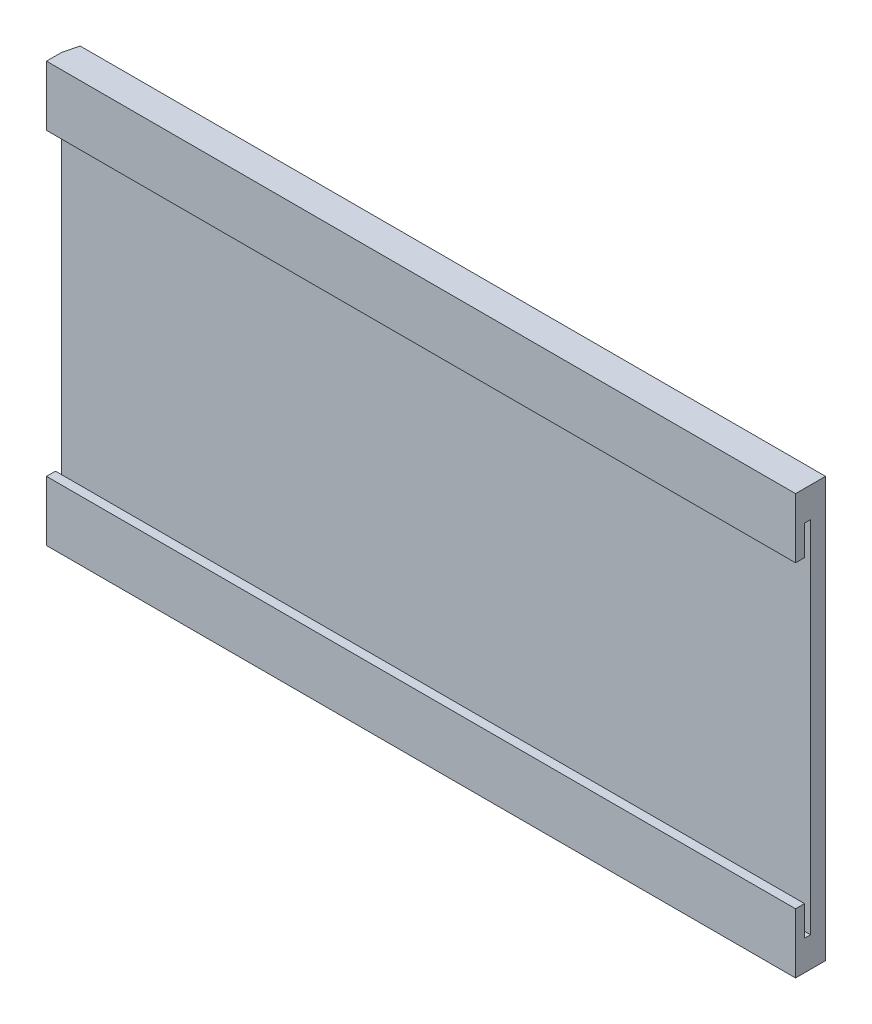
ISO-10303-21;
HEADER;
FILE_DESCRIPTION(('STEP AP214'),'2;1');
FILE_NAME('part.step','',(''),(''),'','','');
FILE_SCHEMA(('AUTOMOTIVE_DESIGN { 1 0 10303 214 1 1 1 1 }'));
ENDSEC;
DATA;
#1=APPLICATION_CONTEXT('core data for automotive mechanical design processes');
#2=APPLICATION_PROTOCOL_DEFINITION('international standard','automotive_design',2000,#1);
#3=PRODUCT_CONTEXT('',#1,'mechanical');
#4=PRODUCT('Part','Part','',(#3));
#5=PRODUCT_RELATED_PRODUCT_CATEGORY('part','',(#4));
#6=PRODUCT_DEFINITION_FORMATION('','',#4);
#7=PRODUCT_DEFINITION_CONTEXT('part definition',#1,'design');
#8=PRODUCT_DEFINITION('design','',#6,#7);
#9=PRODUCT_DEFINITION_SHAPE('','',#8);
#10=(LENGTH_UNIT() NAMED_UNIT(*) SI_UNIT(.MILLI.,.METRE.));
#11=(NAMED_UNIT(*) PLANE_ANGLE_UNIT() SI_UNIT($,.RADIAN.));
#12=(NAMED_UNIT(*) SI_UNIT($,.STERADIAN.) SOLID_ANGLE_UNIT());
#13=UNCERTAINTY_MEASURE_WITH_UNIT(LENGTH_MEASURE(1.E-05),#10,'distance_accuracy_value','');
#14=(GEOMETRIC_REPRESENTATION_CONTEXT(3) GLOBAL_UNCERTAINTY_ASSIGNED_CONTEXT((#13)) GLOBAL_UNIT_ASSIGNED_CONTEXT((#10,
#11,#12)) REPRESENTATION_CONTEXT('',''));
#15=CARTESIAN_POINT('',(0.,0.,0.));
#16=DIRECTION('',(0.,0.,1.));
#17=DIRECTION('',(1.,0.,0.));
#18=AXIS2_PLACEMENT_3D('',#15,#16,#17);
#19=CARTESIAN_POINT('',(0.,0.,-5.));
#20=DIRECTION('',(-1.,0.,0.));
#21=DIRECTION('',(0.,0.,1.));
#22=AXIS2_PLACEMENT_3D('',#19,#20,#21);
#23=PLANE('',#22);
#24=DIRECTION('',(0.,1.,0.));
#25=VECTOR('',#24,1.);
#26=CARTESIAN_POINT('',(0.,-70.,0.));
#27=LINE('',#26,#25);
#28=CARTESIAN_POINT('',(0.,-70.,0.));
#29=VERTEX_POINT('',#28);
#30=CARTESIAN_POINT('',(0.,-60.,0.));
#31=VERTEX_POINT('',#30);
#32=EDGE_CURVE('E238',#29,#31,#27,.T.);
#33=ORIENTED_EDGE('',*,*,#32,.F.);
#34=DIRECTION('',(0.,0.,1.));
#35=VECTOR('',#34,1.);
#36=CARTESIAN_POINT('',(0.,-70.,-5.));
#37=LINE('',#36,#35);
#38=CARTESIAN_POINT('',(0.,-70.,5.));
#39=VERTEX_POINT('',#38);
#40=EDGE_CURVE('E135',#29,#39,#37,.T.);
#41=ORIENTED_EDGE('',*,*,#40,.T.);
#42=DIRECTION('',(0.,-1.,0.));
#43=VECTOR('',#42,1.);
#44=CARTESIAN_POINT('',(0.,0.,5.));
#45=LINE('',#44,#43);
#46=CARTESIAN_POINT('',(0.,-50.,5.));
#47=VERTEX_POINT('',#46);
#48=EDGE_CURVE('E257',#47,#39,#45,.T.);
#49=ORIENTED_EDGE('',*,*,#48,.F.);
#50=DIRECTION('',(0.,0.,-1.));
#51=VECTOR('',#50,1.);
#52=CARTESIAN_POINT('',(0.,-50.,5.));
#53=LINE('',#52,#51);
#54=CARTESIAN_POINT('',(0.,-50.,2.));
#55=VERTEX_POINT('',#54);
#56=EDGE_CURVE('E302',#47,#55,#53,.T.);
#57=ORIENTED_EDGE('',*,*,#56,.T.);
#58=DIRECTION('',(0.,-1.,0.));
#59=VECTOR('',#58,1.);
#60=CARTESIAN_POINT('',(0.,0.,2.));
#61=LINE('',#60,#59);
#62=CARTESIAN_POINT('',(0.,-60.,2.));
#63=VERTEX_POINT('',#62);
#64=EDGE_CURVE('E331',#55,#63,#61,.T.);
#65=ORIENTED_EDGE('',*,*,#64,.T.);
#66=DIRECTION('',(0.,0.,-1.));
#67=VECTOR('',#66,1.);
#68=CARTESIAN_POINT('',(0.,-60.,2.));
#69=LINE('',#68,#67);
#70=EDGE_CURVE('E315',#63,#31,#69,.T.);
#71=ORIENTED_EDGE('',*,*,#70,.T.);
#72=EDGE_LOOP('',(#33,#41,#49,#57,#65,#71));
#73=FACE_BOUND('',#72,.T.);
#74=ADVANCED_FACE('F131',(#73),#23,.T.);
#75=CARTESIAN_POINT('',(0.,0.,5.));
#76=DIRECTION('',(0.,0.,1.));
#77=DIRECTION('',(1.,0.,0.));
#78=AXIS2_PLACEMENT_3D('',#75,#76,#77);
#79=PLANE('',#78);
#80=DIRECTION('',(0.,-1.,0.));
#81=VECTOR('',#80,1.);
#82=CARTESIAN_POINT('',(250.,0.,5.));
#83=LINE('',#82,#81);
#84=CARTESIAN_POINT('',(250.,-50.,5.));
#85=VERTEX_POINT('',#84);
#86=CARTESIAN_POINT('',(250.,-70.,5.));
#87=VERTEX_POINT('',#86);
#88=EDGE_CURVE('E153',#85,#87,#83,.T.);
#89=ORIENTED_EDGE('',*,*,#88,.F.);
#90=DIRECTION('',(1.,0.,0.));
#91=VECTOR('',#90,1.);
#92=CARTESIAN_POINT('',(0.,-50.,5.));
#93=LINE('',#92,#91);
#94=EDGE_CURVE('E284',#47,#85,#93,.T.);
#95=ORIENTED_EDGE('',*,*,#94,.F.);
#96=ORIENTED_EDGE('',*,*,#48,.T.);
#97=DIRECTION('',(1.,0.,0.));
#98=VECTOR('',#97,1.);
#99=CARTESIAN_POINT('',(0.,-70.,5.));
#100=LINE('',#99,#98);
#101=EDGE_CURVE('E263',#39,#87,#100,.T.);
#102=ORIENTED_EDGE('',*,*,#101,.T.);
#103=EDGE_LOOP('',(#89,#95,#96,#102));
#104=FACE_BOUND('',#103,.T.);
#105=ADVANCED_FACE('F283',(#104),#79,.T.);
#106=DIRECTION('',(1.,0.,0.));
#107=VECTOR('',#106,1.);
#108=CARTESIAN_POINT('',(0.,50.,5.));
#109=LINE('',#108,#107);
#110=CARTESIAN_POINT('',(0.,50.,5.));
#111=VERTEX_POINT('',#110);
#112=CARTESIAN_POINT('',(250.,50.,5.));
#113=VERTEX_POINT('',#112);
#114=EDGE_CURVE('E292',#111,#113,#109,.T.);
#115=ORIENTED_EDGE('',*,*,#114,.T.);
#116=CARTESIAN_POINT('',(250.,70.,5.));
#117=VERTEX_POINT('',#116);
#118=EDGE_CURVE('E266',#117,#113,#83,.T.);
#119=ORIENTED_EDGE('',*,*,#118,.F.);
#120=DIRECTION('',(1.,0.,0.));
#121=VECTOR('',#120,1.);
#122=CARTESIAN_POINT('',(0.,70.,5.));
#123=LINE('',#122,#121);
#124=CARTESIAN_POINT('',(0.,70.,5.));
#125=VERTEX_POINT('',#124);
#126=EDGE_CURVE('E255',#125,#117,#123,.T.);
#127=ORIENTED_EDGE('',*,*,#126,.F.);
#128=EDGE_CURVE('E253',#125,#111,#45,.T.);
#129=ORIENTED_EDGE('',*,*,#128,.T.);
#130=EDGE_LOOP('',(#115,#119,#127,#129));
#131=FACE_BOUND('',#130,.T.);
#132=ADVANCED_FACE('F291',(#131),#79,.T.);
#133=CARTESIAN_POINT('',(0.,70.,5.));
#134=DIRECTION('',(0.,1.,0.));
#135=DIRECTION('',(-1.,0.,0.));
#136=AXIS2_PLACEMENT_3D('',#133,#134,#135);
#137=PLANE('',#136);
#138=DIRECTION('',(0.242535625036333,0.,-0.970142500145332));
#139=VECTOR('',#138,1.);
#140=CARTESIAN_POINT('',(0.,70.,0.));
#141=LINE('',#140,#139);
#142=CARTESIAN_POINT('',(0.,70.,0.));
#143=VERTEX_POINT('',#142);
#144=CARTESIAN_POINT('',(1.25,70.,-5.));
#145=VERTEX_POINT('',#144);
#146=EDGE_CURVE('E230',#143,#145,#141,.T.);
#147=ORIENTED_EDGE('',*,*,#146,.F.);
#148=DIRECTION('',(0.,0.,-1.));
#149=VECTOR('',#148,1.);
#150=CARTESIAN_POINT('',(0.,70.,5.));
#151=LINE('',#150,#149);
#152=EDGE_CURVE('E246',#125,#143,#151,.T.);
#153=ORIENTED_EDGE('',*,*,#152,.F.);
#154=ORIENTED_EDGE('',*,*,#126,.T.);
#155=DIRECTION('',(0.,0.,-1.));
#156=VECTOR('',#155,1.);
#157=CARTESIAN_POINT('',(250.,70.,5.));
#158=LINE('',#157,#156);
#159=CARTESIAN_POINT('',(250.,70.,-5.));
#160=VERTEX_POINT('',#159);
#161=EDGE_CURVE('E254',#117,#160,#158,.T.);
#162=ORIENTED_EDGE('',*,*,#161,.T.);
#163=DIRECTION('',(1.,0.,0.));
#164=VECTOR('',#163,1.);
#165=CARTESIAN_POINT('',(0.,70.,-5.));
#166=LINE('',#165,#164);
#167=EDGE_CURVE('E249',#145,#160,#166,.T.);
#168=ORIENTED_EDGE('',*,*,#167,.F.);
#169=EDGE_LOOP('',(#147,#153,#154,#162,#168));
#170=FACE_BOUND('',#169,.T.);
#171=ADVANCED_FACE('F244',(#170),#137,.T.);
#172=CARTESIAN_POINT('',(250.,0.,-5.));
#173=DIRECTION('',(-1.,0.,0.));
#174=DIRECTION('',(0.,0.,1.));
#175=AXIS2_PLACEMENT_3D('',#172,#173,#174);
#176=PLANE('',#175);
#177=DIRECTION('',(0.,0.,-1.));
#178=VECTOR('',#177,1.);
#179=CARTESIAN_POINT('',(250.,50.,5.));
#180=LINE('',#179,#178);
#181=CARTESIAN_POINT('',(250.,50.,2.));
#182=VERTEX_POINT('',#181);
#183=EDGE_CURVE('E294',#113,#182,#180,.T.);
#184=ORIENTED_EDGE('',*,*,#183,.T.);
#185=DIRECTION('',(0.,-1.,0.));
#186=VECTOR('',#185,1.);
#187=CARTESIAN_POINT('',(250.,0.,2.));
#188=LINE('',#187,#186);
#189=CARTESIAN_POINT('',(250.,60.,2.));
#190=VERTEX_POINT('',#189);
#191=EDGE_CURVE('E296',#190,#182,#188,.T.);
#192=ORIENTED_EDGE('',*,*,#191,.F.);
#193=DIRECTION('',(0.,0.,-1.));
#194=VECTOR('',#193,1.);
#195=CARTESIAN_POINT('',(250.,60.,2.));
#196=LINE('',#195,#194);
#197=CARTESIAN_POINT('',(250.,60.,0.));
#198=VERTEX_POINT('',#197);
#199=EDGE_CURVE('E312',#190,#198,#196,.T.);
#200=ORIENTED_EDGE('',*,*,#199,.T.);
#201=DIRECTION('',(0.,-1.,0.));
#202=VECTOR('',#201,1.);
#203=CARTESIAN_POINT('',(250.,0.,0.));
#204=LINE('',#203,#202);
#205=CARTESIAN_POINT('',(250.,-60.,0.));
#206=VERTEX_POINT('',#205);
#207=EDGE_CURVE('E310',#198,#206,#204,.T.);
#208=ORIENTED_EDGE('',*,*,#207,.T.);
#209=DIRECTION('',(0.,0.,-1.));
#210=VECTOR('',#209,1.);
#211=CARTESIAN_POINT('',(250.,-60.,2.));
#212=LINE('',#211,#210);
#213=CARTESIAN_POINT('',(250.,-60.,2.));
#214=VERTEX_POINT('',#213);
#215=EDGE_CURVE('E318',#214,#206,#212,.T.);
#216=ORIENTED_EDGE('',*,*,#215,.F.);
#217=DIRECTION('',(0.,-1.,0.));
#218=VECTOR('',#217,1.);
#219=CARTESIAN_POINT('',(250.,0.,2.));
#220=LINE('',#219,#218);
#221=CARTESIAN_POINT('',(250.,-50.,2.));
#222=VERTEX_POINT('',#221);
#223=EDGE_CURVE('E321',#222,#214,#220,.T.);
#224=ORIENTED_EDGE('',*,*,#223,.F.);
#225=DIRECTION('',(0.,0.,-1.));
#226=VECTOR('',#225,1.);
#227=CARTESIAN_POINT('',(250.,-50.,5.));
#228=LINE('',#227,#226);
#229=EDGE_CURVE('E306',#85,#222,#228,.T.);
#230=ORIENTED_EDGE('',*,*,#229,.F.);
#231=ORIENTED_EDGE('',*,*,#88,.T.);
#232=DIRECTION('',(0.,0.,1.));
#233=VECTOR('',#232,1.);
#234=CARTESIAN_POINT('',(250.,-70.,-5.));
#235=LINE('',#234,#233);
#236=CARTESIAN_POINT('',(250.,-70.,-5.));
#237=VERTEX_POINT('',#236);
#238=EDGE_CURVE('E12',#237,#87,#235,.T.);
#239=ORIENTED_EDGE('',*,*,#238,.F.);
#240=DIRECTION('',(0.,-1.,0.));
#241=VECTOR('',#240,1.);
#242=CARTESIAN_POINT('',(250.,0.,-5.));
#243=LINE('',#242,#241);
#244=EDGE_CURVE('E270',#160,#237,#243,.T.);
#245=ORIENTED_EDGE('',*,*,#244,.F.);
#246=ORIENTED_EDGE('',*,*,#161,.F.);
#247=ORIENTED_EDGE('',*,*,#118,.T.);
#248=EDGE_LOOP('',(#184,#192,#200,#208,#216,#224,#230,#231,#239,#245,#246,#247));
#249=FACE_BOUND('',#248,.T.);
#250=ADVANCED_FACE('F287',(#249),#176,.F.);
#251=CARTESIAN_POINT('',(0.,-70.,-5.));
#252=DIRECTION('',(0.,-1.,0.));
#253=DIRECTION('',(1.,0.,0.));
#254=AXIS2_PLACEMENT_3D('',#251,#252,#253);
#255=PLANE('',#254);
#256=DIRECTION('',(0.242535625036333,0.,-0.970142500145332));
#257=VECTOR('',#256,1.);
#258=CARTESIAN_POINT('',(0.,-70.,0.));
#259=LINE('',#258,#257);
#260=CARTESIAN_POINT('',(1.25,-70.,-5.));
#261=VERTEX_POINT('',#260);
#262=EDGE_CURVE('E239',#29,#261,#259,.T.);
#263=ORIENTED_EDGE('',*,*,#262,.T.);
#264=DIRECTION('',(1.,0.,0.));
#265=VECTOR('',#264,1.);
#266=CARTESIAN_POINT('',(0.,-70.,-5.));
#267=LINE('',#266,#265);
#268=EDGE_CURVE('E145',#261,#237,#267,.T.);
#269=ORIENTED_EDGE('',*,*,#268,.T.);
#270=ORIENTED_EDGE('',*,*,#238,.T.);
#271=ORIENTED_EDGE('',*,*,#101,.F.);
#272=ORIENTED_EDGE('',*,*,#40,.F.);
#273=EDGE_LOOP('',(#263,#269,#270,#271,#272));
#274=FACE_BOUND('',#273,.T.);
#275=ADVANCED_FACE('F285',(#274),#255,.T.);
#276=CARTESIAN_POINT('',(0.,60.,0.));
#277=VERTEX_POINT('',#276);
#278=EDGE_CURVE('E227',#277,#143,#27,.T.);
#279=ORIENTED_EDGE('',*,*,#278,.F.);
#280=DIRECTION('',(0.,0.,-1.));
#281=VECTOR('',#280,1.);
#282=CARTESIAN_POINT('',(0.,60.,2.));
#283=LINE('',#282,#281);
#284=CARTESIAN_POINT('',(0.,60.,2.));
#285=VERTEX_POINT('',#284);
#286=EDGE_CURVE('E336',#285,#277,#283,.T.);
#287=ORIENTED_EDGE('',*,*,#286,.F.);
#288=DIRECTION('',(0.,-1.,0.));
#289=VECTOR('',#288,1.);
#290=CARTESIAN_POINT('',(0.,0.,2.));
#291=LINE('',#290,#289);
#292=CARTESIAN_POINT('',(0.,50.,2.));
#293=VERTEX_POINT('',#292);
#294=EDGE_CURVE('E341',#285,#293,#291,.T.);
#295=ORIENTED_EDGE('',*,*,#294,.T.);
#296=DIRECTION('',(0.,0.,-1.));
#297=VECTOR('',#296,1.);
#298=CARTESIAN_POINT('',(0.,50.,5.));
#299=LINE('',#298,#297);
#300=EDGE_CURVE('E299',#111,#293,#299,.T.);
#301=ORIENTED_EDGE('',*,*,#300,.F.);
#302=ORIENTED_EDGE('',*,*,#128,.F.);
#303=ORIENTED_EDGE('',*,*,#152,.T.);
#304=EDGE_LOOP('',(#279,#287,#295,#301,#302,#303));
#305=FACE_BOUND('',#304,.T.);
#306=ADVANCED_FACE('F133',(#305),#23,.T.);
#307=CARTESIAN_POINT('',(0.,0.,-5.));
#308=DIRECTION('',(0.,0.,1.));
#309=DIRECTION('',(1.,0.,0.));
#310=AXIS2_PLACEMENT_3D('',#307,#308,#309);
#311=PLANE('',#310);
#312=ORIENTED_EDGE('',*,*,#268,.F.);
#313=DIRECTION('',(0.,1.,0.));
#314=VECTOR('',#313,1.);
#315=CARTESIAN_POINT('',(1.25,0.,-5.));
#316=LINE('',#315,#314);
#317=EDGE_CURVE('E326',#261,#145,#316,.T.);
#318=ORIENTED_EDGE('',*,*,#317,.T.);
#319=ORIENTED_EDGE('',*,*,#167,.T.);
#320=ORIENTED_EDGE('',*,*,#244,.T.);
#321=EDGE_LOOP('',(#312,#318,#319,#320));
#322=FACE_BOUND('',#321,.T.);
#323=ADVANCED_FACE('F350',(#322),#311,.F.);
#324=CARTESIAN_POINT('',(0.,50.,5.));
#325=DIRECTION('',(0.,1.,0.));
#326=DIRECTION('',(0.,0.,1.));
#327=AXIS2_PLACEMENT_3D('',#324,#325,#326);
#328=PLANE('',#327);
#329=ORIENTED_EDGE('',*,*,#300,.T.);
#330=DIRECTION('',(1.,0.,0.));
#331=VECTOR('',#330,1.);
#332=CARTESIAN_POINT('',(0.,50.,2.));
#333=LINE('',#332,#331);
#334=EDGE_CURVE('E345',#293,#182,#333,.T.);
#335=ORIENTED_EDGE('',*,*,#334,.T.);
#336=ORIENTED_EDGE('',*,*,#183,.F.);
#337=ORIENTED_EDGE('',*,*,#114,.F.);
#338=EDGE_LOOP('',(#329,#335,#336,#337));
#339=FACE_BOUND('',#338,.T.);
#340=ADVANCED_FACE('F352',(#339),#328,.F.);
#341=CARTESIAN_POINT('',(0.,-50.,5.));
#342=DIRECTION('',(0.,1.,0.));
#343=DIRECTION('',(0.,0.,1.));
#344=AXIS2_PLACEMENT_3D('',#341,#342,#343);
#345=PLANE('',#344);
#346=DIRECTION('',(1.,0.,0.));
#347=VECTOR('',#346,1.);
#348=CARTESIAN_POINT('',(0.,-50.,2.));
#349=LINE('',#348,#347);
#350=EDGE_CURVE('E325',#55,#222,#349,.T.);
#351=ORIENTED_EDGE('',*,*,#350,.F.);
#352=ORIENTED_EDGE('',*,*,#56,.F.);
#353=ORIENTED_EDGE('',*,*,#94,.T.);
#354=ORIENTED_EDGE('',*,*,#229,.T.);
#355=EDGE_LOOP('',(#351,#352,#353,#354));
#356=FACE_BOUND('',#355,.T.);
#357=ADVANCED_FACE('F358',(#356),#345,.T.);
#358=CARTESIAN_POINT('',(0.,0.,0.));
#359=DIRECTION('',(0.,0.,1.));
#360=DIRECTION('',(1.,0.,0.));
#361=AXIS2_PLACEMENT_3D('',#358,#359,#360);
#362=PLANE('',#361);
#363=ORIENTED_EDGE('',*,*,#207,.F.);
#364=DIRECTION('',(1.,0.,0.));
#365=VECTOR('',#364,1.);
#366=CARTESIAN_POINT('',(0.,60.,0.));
#367=LINE('',#366,#365);
#368=EDGE_CURVE('E317',#277,#198,#367,.T.);
#369=ORIENTED_EDGE('',*,*,#368,.F.);
#370=DIRECTION('',(0.,-1.,0.));
#371=VECTOR('',#370,1.);
#372=CARTESIAN_POINT('',(0.,0.,0.));
#373=LINE('',#372,#371);
#374=EDGE_CURVE('E233',#277,#31,#373,.T.);
#375=ORIENTED_EDGE('',*,*,#374,.T.);
#376=DIRECTION('',(1.,0.,0.));
#377=VECTOR('',#376,1.);
#378=CARTESIAN_POINT('',(0.,-60.,0.));
#379=LINE('',#378,#377);
#380=EDGE_CURVE('E322',#31,#206,#379,.T.);
#381=ORIENTED_EDGE('',*,*,#380,.T.);
#382=EDGE_LOOP('',(#363,#369,#375,#381));
#383=FACE_BOUND('',#382,.T.);
#384=ADVANCED_FACE('F374',(#383),#362,.T.);
#385=CARTESIAN_POINT('',(0.,-60.,2.));
#386=DIRECTION('',(0.,1.,0.));
#387=DIRECTION('',(-1.,0.,0.));
#388=AXIS2_PLACEMENT_3D('',#385,#386,#387);
#389=PLANE('',#388);
#390=ORIENTED_EDGE('',*,*,#380,.F.);
#391=ORIENTED_EDGE('',*,*,#70,.F.);
#392=DIRECTION('',(1.,0.,0.));
#393=VECTOR('',#392,1.);
#394=CARTESIAN_POINT('',(0.,-60.,2.));
#395=LINE('',#394,#393);
#396=EDGE_CURVE('E329',#63,#214,#395,.T.);
#397=ORIENTED_EDGE('',*,*,#396,.T.);
#398=ORIENTED_EDGE('',*,*,#215,.T.);
#399=EDGE_LOOP('',(#390,#391,#397,#398));
#400=FACE_BOUND('',#399,.T.);
#401=ADVANCED_FACE('F378',(#400),#389,.T.);
#402=CARTESIAN_POINT('',(0.,0.,2.));
#403=DIRECTION('',(0.,0.,1.));
#404=DIRECTION('',(1.,0.,0.));
#405=AXIS2_PLACEMENT_3D('',#402,#403,#404);
#406=PLANE('',#405);
#407=ORIENTED_EDGE('',*,*,#350,.T.);
#408=ORIENTED_EDGE('',*,*,#223,.T.);
#409=ORIENTED_EDGE('',*,*,#396,.F.);
#410=ORIENTED_EDGE('',*,*,#64,.F.);
#411=EDGE_LOOP('',(#407,#408,#409,#410));
#412=FACE_BOUND('',#411,.T.);
#413=ADVANCED_FACE('F382',(#412),#406,.F.);
#414=CARTESIAN_POINT('',(0.,60.,2.));
#415=DIRECTION('',(0.,1.,0.));
#416=DIRECTION('',(0.,0.,1.));
#417=AXIS2_PLACEMENT_3D('',#414,#415,#416);
#418=PLANE('',#417);
#419=ORIENTED_EDGE('',*,*,#368,.T.);
#420=ORIENTED_EDGE('',*,*,#199,.F.);
#421=DIRECTION('',(1.,0.,0.));
#422=VECTOR('',#421,1.);
#423=CARTESIAN_POINT('',(0.,60.,2.));
#424=LINE('',#423,#422);
#425=EDGE_CURVE('E338',#285,#190,#424,.T.);
#426=ORIENTED_EDGE('',*,*,#425,.F.);
#427=ORIENTED_EDGE('',*,*,#286,.T.);
#428=EDGE_LOOP('',(#419,#420,#426,#427));
#429=FACE_BOUND('',#428,.T.);
#430=ADVANCED_FACE('F386',(#429),#418,.F.);
#431=CARTESIAN_POINT('',(0.,0.,2.));
#432=DIRECTION('',(0.,0.,1.));
#433=DIRECTION('',(1.,0.,0.));
#434=AXIS2_PLACEMENT_3D('',#431,#432,#433);
#435=PLANE('',#434);
#436=ORIENTED_EDGE('',*,*,#294,.F.);
#437=ORIENTED_EDGE('',*,*,#425,.T.);
#438=ORIENTED_EDGE('',*,*,#191,.T.);
#439=ORIENTED_EDGE('',*,*,#334,.F.);
#440=EDGE_LOOP('',(#436,#437,#438,#439));
#441=FACE_BOUND('',#440,.T.);
#442=ADVANCED_FACE('F390',(#441),#435,.F.);
#443=CARTESIAN_POINT('',(0.,-70.,0.));
#444=DIRECTION('',(0.970142500145332,0.,0.242535625036333));
#445=DIRECTION('',(0.242535625036333,0.,-0.970142500145332));
#446=AXIS2_PLACEMENT_3D('',#443,#444,#445);
#447=PLANE('',#446);
#448=ORIENTED_EDGE('',*,*,#262,.F.);
#449=ORIENTED_EDGE('',*,*,#32,.T.);
#450=ORIENTED_EDGE('',*,*,#374,.F.);
#451=ORIENTED_EDGE('',*,*,#278,.T.);
#452=ORIENTED_EDGE('',*,*,#146,.T.);
#453=ORIENTED_EDGE('',*,*,#317,.F.);
#454=EDGE_LOOP('',(#448,#449,#450,#451,#452,#453));
#455=FACE_BOUND('',#454,.T.);
#456=ADVANCED_FACE('F229',(#455),#447,.F.);
#457=CLOSED_SHELL('',(#74,#105,#132,#171,#250,#275,#306,#323,#340,#357,#384,#401,#413,#430,#442,#456));
#458=MANIFOLD_SOLID_BREP('B2',#457);
#459=ADVANCED_BREP_SHAPE_REPRESENTATION('',(#18,#458),#14);
#460=SHAPE_DEFINITION_REPRESENTATION(#9,#459);
ENDSEC;
END-ISO-10303-21;
